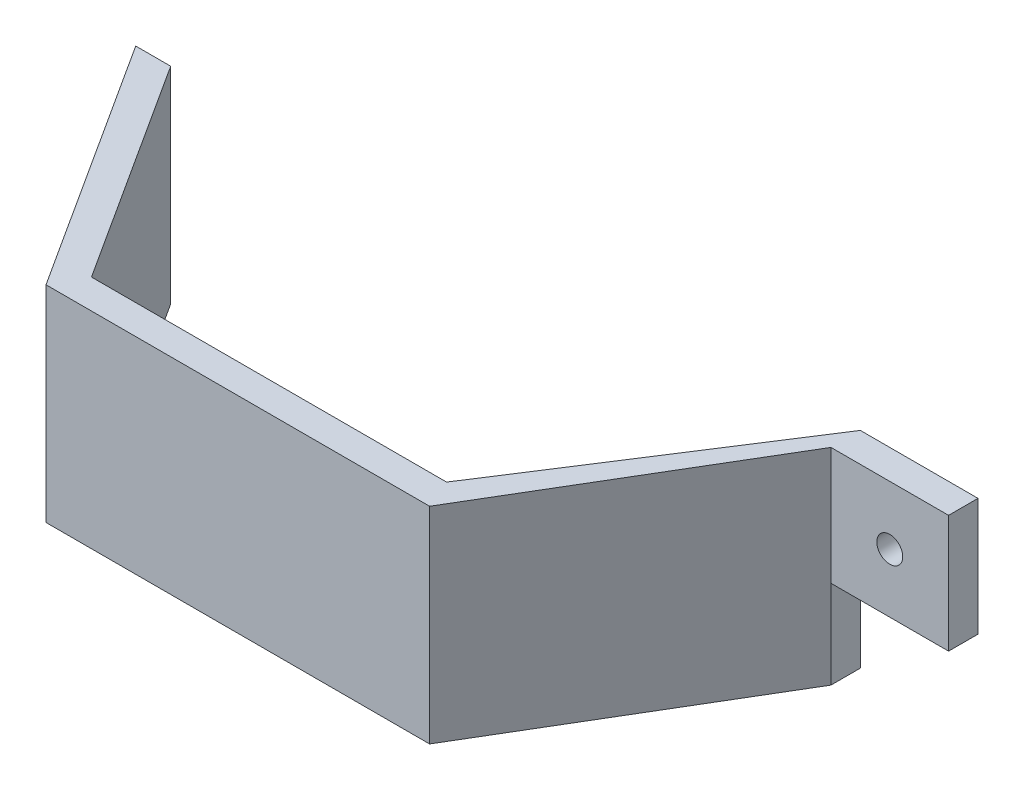
ISO-10303-21;
HEADER;
FILE_DESCRIPTION(('STEP AP214'),'2;1');
FILE_NAME('part.step','',(''),(''),'','','');
FILE_SCHEMA(('AUTOMOTIVE_DESIGN { 1 0 10303 214 1 1 1 1 }'));
ENDSEC;
DATA;
#1=APPLICATION_CONTEXT('core data for automotive mechanical design processes');
#2=APPLICATION_PROTOCOL_DEFINITION('international standard','automotive_design',2000,#1);
#3=PRODUCT_CONTEXT('',#1,'mechanical');
#4=PRODUCT('Part','Part','',(#3));
#5=PRODUCT_RELATED_PRODUCT_CATEGORY('part','',(#4));
#6=PRODUCT_DEFINITION_FORMATION('','',#4);
#7=PRODUCT_DEFINITION_CONTEXT('part definition',#1,'design');
#8=PRODUCT_DEFINITION('design','',#6,#7);
#9=PRODUCT_DEFINITION_SHAPE('','',#8);
#10=(LENGTH_UNIT() NAMED_UNIT(*) SI_UNIT(.MILLI.,.METRE.));
#11=(NAMED_UNIT(*) PLANE_ANGLE_UNIT() SI_UNIT($,.RADIAN.));
#12=(NAMED_UNIT(*) SI_UNIT($,.STERADIAN.) SOLID_ANGLE_UNIT());
#13=UNCERTAINTY_MEASURE_WITH_UNIT(LENGTH_MEASURE(1.E-05),#10,'distance_accuracy_value','');
#14=(GEOMETRIC_REPRESENTATION_CONTEXT(3) GLOBAL_UNCERTAINTY_ASSIGNED_CONTEXT((#13)) GLOBAL_UNIT_ASSIGNED_CONTEXT((#10,
#11,#12)) REPRESENTATION_CONTEXT('',''));
#15=CARTESIAN_POINT('',(0.,0.,0.));
#16=DIRECTION('',(0.,0.,1.));
#17=DIRECTION('',(1.,0.,0.));
#18=AXIS2_PLACEMENT_3D('',#15,#16,#17);
#19=CARTESIAN_POINT('',(-9.9497487437186,-10.3015075376884,5.));
#20=DIRECTION('',(0.,1.,0.));
#21=DIRECTION('',(0.,0.,1.));
#22=AXIS2_PLACEMENT_3D('',#19,#20,#21);
#23=PLANE('',#22);
#24=DIRECTION('',(1.,0.,0.));
#25=VECTOR('',#24,1.);
#26=CARTESIAN_POINT('',(-9.9497487437186,-10.3015075376884,0.));
#27=LINE('',#26,#25);
#28=CARTESIAN_POINT('',(-9.9497487437186,-10.3015075376884,0.));
#29=VERTEX_POINT('',#28);
#30=CARTESIAN_POINT('',(10.0502512562814,-10.3015075376884,0.));
#31=VERTEX_POINT('',#30);
#32=EDGE_CURVE('E62',#29,#31,#27,.T.);
#33=ORIENTED_EDGE('',*,*,#32,.T.);
#34=DIRECTION('',(0.,0.,-1.));
#35=VECTOR('',#34,1.);
#36=CARTESIAN_POINT('',(10.0502512562814,-10.3015075376884,5.));
#37=LINE('',#36,#35);
#38=CARTESIAN_POINT('',(10.0502512562814,-10.3015075376884,5.));
#39=VERTEX_POINT('',#38);
#40=EDGE_CURVE('E41',#39,#31,#37,.T.);
#41=ORIENTED_EDGE('',*,*,#40,.F.);
#42=DIRECTION('',(1.,0.,0.));
#43=VECTOR('',#42,1.);
#44=CARTESIAN_POINT('',(-9.9497487437186,-10.3015075376884,5.));
#45=LINE('',#44,#43);
#46=CARTESIAN_POINT('',(-9.9497487437186,-10.3015075376884,5.));
#47=VERTEX_POINT('',#46);
#48=EDGE_CURVE('E91',#47,#39,#45,.T.);
#49=ORIENTED_EDGE('',*,*,#48,.F.);
#50=DIRECTION('',(0.,0.,-1.));
#51=VECTOR('',#50,1.);
#52=CARTESIAN_POINT('',(-9.9497487437186,-10.3015075376884,5.));
#53=LINE('',#52,#51);
#54=EDGE_CURVE('E11',#47,#29,#53,.T.);
#55=ORIENTED_EDGE('',*,*,#54,.T.);
#56=EDGE_LOOP('',(#33,#41,#49,#55));
#57=FACE_BOUND('',#56,.T.);
#58=ADVANCED_FACE('F33',(#57),#23,.F.);
#59=CARTESIAN_POINT('',(10.0502512562814,9.69849246231156,5.));
#60=DIRECTION('',(-1.,0.,0.));
#61=DIRECTION('',(0.,-1.,0.));
#62=AXIS2_PLACEMENT_3D('',#59,#60,#61);
#63=PLANE('',#62);
#64=DIRECTION('',(0.,1.,0.));
#65=VECTOR('',#64,1.);
#66=CARTESIAN_POINT('',(10.0502512562814,9.69849246231156,0.));
#67=LINE('',#66,#65);
#68=CARTESIAN_POINT('',(10.0502512562814,9.69849246231156,0.));
#69=VERTEX_POINT('',#68);
#70=EDGE_CURVE('E67',#31,#69,#67,.T.);
#71=ORIENTED_EDGE('',*,*,#70,.T.);
#72=DIRECTION('',(0.,0.,-1.));
#73=VECTOR('',#72,1.);
#74=CARTESIAN_POINT('',(10.0502512562814,9.69849246231156,5.));
#75=LINE('',#74,#73);
#76=CARTESIAN_POINT('',(10.0502512562814,9.69849246231156,5.));
#77=VERTEX_POINT('',#76);
#78=EDGE_CURVE('E70',#77,#69,#75,.T.);
#79=ORIENTED_EDGE('',*,*,#78,.F.);
#80=DIRECTION('',(0.,1.,0.));
#81=VECTOR('',#80,1.);
#82=CARTESIAN_POINT('',(10.0502512562814,9.69849246231156,5.));
#83=LINE('',#82,#81);
#84=EDGE_CURVE('E49',#39,#77,#83,.T.);
#85=ORIENTED_EDGE('',*,*,#84,.F.);
#86=ORIENTED_EDGE('',*,*,#40,.T.);
#87=EDGE_LOOP('',(#71,#79,#85,#86));
#88=FACE_BOUND('',#87,.T.);
#89=ADVANCED_FACE('F69',(#88),#63,.F.);
#90=CARTESIAN_POINT('',(-9.9497487437186,9.69849246231156,5.));
#91=DIRECTION('',(0.,-1.,0.));
#92=DIRECTION('',(1.,0.,0.));
#93=AXIS2_PLACEMENT_3D('',#90,#91,#92);
#94=PLANE('',#93);
#95=DIRECTION('',(-1.,0.,0.));
#96=VECTOR('',#95,1.);
#97=CARTESIAN_POINT('',(-9.9497487437186,9.69849246231156,0.));
#98=LINE('',#97,#96);
#99=CARTESIAN_POINT('',(-9.9497487437186,9.69849246231156,0.));
#100=VERTEX_POINT('',#99);
#101=EDGE_CURVE('E74',#69,#100,#98,.T.);
#102=ORIENTED_EDGE('',*,*,#101,.T.);
#103=DIRECTION('',(-0.541636260188725,0.,0.84061296780907));
#104=VECTOR('',#103,1.);
#105=CARTESIAN_POINT('',(-37.5112836926405,9.69849246231156,42.7751710764599));
#106=LINE('',#105,#104);
#107=CARTESIAN_POINT('',(-37.5112836926405,9.69849246231156,42.7751710764599));
#108=VERTEX_POINT('',#107);
#109=EDGE_CURVE('E147',#100,#108,#106,.T.);
#110=ORIENTED_EDGE('',*,*,#109,.T.);
#111=DIRECTION('',(-1.,0.,0.));
#112=VECTOR('',#111,1.);
#113=CARTESIAN_POINT('',(-97.8784909577664,9.69849246231157,42.7751710764599));
#114=LINE('',#113,#112);
#115=CARTESIAN_POINT('',(-97.8784909577664,9.69849246231157,42.7751710764599));
#116=VERTEX_POINT('',#115);
#117=EDGE_CURVE('E144',#108,#116,#114,.T.);
#118=ORIENTED_EDGE('',*,*,#117,.T.);
#119=DIRECTION('',(-0.541084804986544,0.,-0.840968033763872));
#120=VECTOR('',#119,1.);
#121=CARTESIAN_POINT('',(-122.183304285521,9.69849246231157,5.));
#122=LINE('',#121,#120);
#123=CARTESIAN_POINT('',(-122.183304285521,9.69849246231157,5.));
#124=VERTEX_POINT('',#123);
#125=EDGE_CURVE('E141',#116,#124,#122,.T.);
#126=ORIENTED_EDGE('',*,*,#125,.T.);
#127=DIRECTION('',(-1.,0.,0.));
#128=VECTOR('',#127,1.);
#129=CARTESIAN_POINT('',(-128.12883348432,9.69849246231157,5.));
#130=LINE('',#129,#128);
#131=CARTESIAN_POINT('',(-128.12883348432,9.69849246231157,5.));
#132=VERTEX_POINT('',#131);
#133=EDGE_CURVE('E138',#124,#132,#130,.T.);
#134=ORIENTED_EDGE('',*,*,#133,.T.);
#135=DIRECTION('',(0.541084804986544,0.,0.840968033763872));
#136=VECTOR('',#135,1.);
#137=CARTESIAN_POINT('',(-100.606984649492,9.69849246231157,47.7751710764599));
#138=LINE('',#137,#136);
#139=CARTESIAN_POINT('',(-100.606984649492,9.69849246231157,47.7751710764599));
#140=VERTEX_POINT('',#139);
#141=EDGE_CURVE('E135',#132,#140,#138,.T.);
#142=ORIENTED_EDGE('',*,*,#141,.T.);
#143=DIRECTION('',(1.,0.,0.));
#144=VECTOR('',#143,1.);
#145=CARTESIAN_POINT('',(-35.3984769606323,9.69849246231156,47.7751710764599));
#146=LINE('',#145,#144);
#147=CARTESIAN_POINT('',(-35.3984769606323,9.69849246231156,47.7751710764599));
#148=VERTEX_POINT('',#147);
#149=EDGE_CURVE('E132',#140,#148,#146,.T.);
#150=ORIENTED_EDGE('',*,*,#149,.T.);
#151=DIRECTION('',(0.511295692748654,0.,-0.859404860689463));
#152=VECTOR('',#151,1.);
#153=CARTESIAN_POINT('',(-9.9497487437186,9.69849246231156,5.));
#154=LINE('',#153,#152);
#155=CARTESIAN_POINT('',(-9.9497487437186,9.69849246231156,5.));
#156=VERTEX_POINT('',#155);
#157=EDGE_CURVE('E129',#148,#156,#154,.T.);
#158=ORIENTED_EDGE('',*,*,#157,.T.);
#159=DIRECTION('',(-1.,0.,0.));
#160=VECTOR('',#159,1.);
#161=CARTESIAN_POINT('',(-9.9497487437186,9.69849246231156,5.));
#162=LINE('',#161,#160);
#163=EDGE_CURVE('E83',#77,#156,#162,.T.);
#164=ORIENTED_EDGE('',*,*,#163,.F.);
#165=ORIENTED_EDGE('',*,*,#78,.T.);
#166=EDGE_LOOP('',(#102,#110,#118,#126,#134,#142,#150,#158,#164,#165));
#167=FACE_BOUND('',#166,.T.);
#168=ADVANCED_FACE('F78',(#167),#94,.F.);
#169=CARTESIAN_POINT('',(0.,0.,5.));
#170=DIRECTION('',(0.,0.,1.));
#171=DIRECTION('',(1.,0.,0.));
#172=AXIS2_PLACEMENT_3D('',#169,#170,#171);
#173=PLANE('',#172);
#174=CARTESIAN_POINT('',(0.0502512562814052,-0.30150753768844,5.));
#175=DIRECTION('',(0.,0.,1.));
#176=DIRECTION('',(1.,0.,0.));
#177=AXIS2_PLACEMENT_3D('',#174,#175,#176);
#178=CIRCLE('',#177,2.2);
#179=CARTESIAN_POINT('',(2.25025125628141,-0.30150753768844,5.));
#180=VERTEX_POINT('',#179);
#181=EDGE_CURVE('E100',#180,#180,#178,.T.);
#182=ORIENTED_EDGE('',*,*,#181,.F.);
#183=EDGE_LOOP('',(#182));
#184=FACE_BOUND('',#183,.T.);
#185=DIRECTION('',(0.,-1.,0.));
#186=VECTOR('',#185,1.);
#187=CARTESIAN_POINT('',(-9.9497487437186,9.69849246231156,5.));
#188=LINE('',#187,#186);
#189=EDGE_CURVE('E88',#156,#47,#188,.T.);
#190=ORIENTED_EDGE('',*,*,#189,.T.);
#191=ORIENTED_EDGE('',*,*,#48,.T.);
#192=ORIENTED_EDGE('',*,*,#84,.T.);
#193=ORIENTED_EDGE('',*,*,#163,.T.);
#194=EDGE_LOOP('',(#190,#191,#192,#193));
#195=FACE_BOUND('',#194,.T.);
#196=ADVANCED_FACE('F226',(#184,#195),#173,.T.);
#197=CARTESIAN_POINT('',(0.,0.,0.));
#198=DIRECTION('',(0.,0.,1.));
#199=DIRECTION('',(1.,0.,0.));
#200=AXIS2_PLACEMENT_3D('',#197,#198,#199);
#201=PLANE('',#200);
#202=CARTESIAN_POINT('',(0.0502512562814052,-0.30150753768844,0.));
#203=DIRECTION('',(0.,0.,1.));
#204=DIRECTION('',(1.,0.,0.));
#205=AXIS2_PLACEMENT_3D('',#202,#203,#204);
#206=CIRCLE('',#205,2.2);
#207=CARTESIAN_POINT('',(2.25025125628141,-0.30150753768844,0.));
#208=VERTEX_POINT('',#207);
#209=EDGE_CURVE('E96',#208,#208,#206,.T.);
#210=ORIENTED_EDGE('',*,*,#209,.T.);
#211=EDGE_LOOP('',(#210));
#212=FACE_BOUND('',#211,.T.);
#213=DIRECTION('',(0.,-1.,0.));
#214=VECTOR('',#213,1.);
#215=CARTESIAN_POINT('',(-9.9497487437186,9.69849246231156,0.));
#216=LINE('',#215,#214);
#217=EDGE_CURVE('E87',#100,#29,#216,.T.);
#218=ORIENTED_EDGE('',*,*,#217,.F.);
#219=ORIENTED_EDGE('',*,*,#101,.F.);
#220=ORIENTED_EDGE('',*,*,#70,.F.);
#221=ORIENTED_EDGE('',*,*,#32,.F.);
#222=EDGE_LOOP('',(#218,#219,#220,#221));
#223=FACE_BOUND('',#222,.T.);
#224=ADVANCED_FACE('F85',(#212,#223),#201,.F.);
#225=CARTESIAN_POINT('',(0.0502512562814052,-0.30150753768844,0.));
#226=DIRECTION('',(0.,0.,1.));
#227=DIRECTION('',(1.,0.,0.));
#228=AXIS2_PLACEMENT_3D('',#225,#226,#227);
#229=CYLINDRICAL_SURFACE('',#228,2.2);
#230=ORIENTED_EDGE('',*,*,#209,.F.);
#231=EDGE_LOOP('',(#230));
#232=FACE_BOUND('',#231,.T.);
#233=ORIENTED_EDGE('',*,*,#181,.T.);
#234=EDGE_LOOP('',(#233));
#235=FACE_BOUND('',#234,.T.);
#236=ADVANCED_FACE('F266',(#232,#235),#229,.F.);
#237=CARTESIAN_POINT('',(-9.9497487437186,-25.3015075376885,0.));
#238=DIRECTION('',(1.,0.,0.));
#239=DIRECTION('',(0.,1.,0.));
#240=AXIS2_PLACEMENT_3D('',#237,#238,#239);
#241=PLANE('',#240);
#242=ORIENTED_EDGE('',*,*,#54,.F.);
#243=DIRECTION('',(0.,1.,0.));
#244=VECTOR('',#243,1.);
#245=CARTESIAN_POINT('',(-9.9497487437186,-25.3015075376885,5.));
#246=LINE('',#245,#244);
#247=CARTESIAN_POINT('',(-9.9497487437186,-25.3015075376885,5.));
#248=VERTEX_POINT('',#247);
#249=EDGE_CURVE('E103',#248,#47,#246,.T.);
#250=ORIENTED_EDGE('',*,*,#249,.F.);
#251=DIRECTION('',(0.,0.,-1.));
#252=VECTOR('',#251,1.);
#253=CARTESIAN_POINT('',(-9.9497487437186,-25.3015075376885,0.));
#254=LINE('',#253,#252);
#255=CARTESIAN_POINT('',(-9.9497487437186,-25.3015075376885,0.));
#256=VERTEX_POINT('',#255);
#257=EDGE_CURVE('E131',#248,#256,#254,.T.);
#258=ORIENTED_EDGE('',*,*,#257,.T.);
#259=DIRECTION('',(0.,1.,0.));
#260=VECTOR('',#259,1.);
#261=CARTESIAN_POINT('',(-9.9497487437186,-25.3015075376885,0.));
#262=LINE('',#261,#260);
#263=EDGE_CURVE('E106',#256,#29,#262,.T.);
#264=ORIENTED_EDGE('',*,*,#263,.T.);
#265=EDGE_LOOP('',(#242,#250,#258,#264));
#266=FACE_BOUND('',#265,.T.);
#267=ADVANCED_FACE('F175',(#266),#241,.T.);
#268=CARTESIAN_POINT('',(-9.9497487437186,-25.3015075376885,5.));
#269=DIRECTION('',(0.859404860689462,0.,0.511295692748653));
#270=DIRECTION('',(0.511295692748654,0.,-0.859404860689463));
#271=AXIS2_PLACEMENT_3D('',#268,#269,#270);
#272=PLANE('',#271);
#273=ORIENTED_EDGE('',*,*,#157,.F.);
#274=DIRECTION('',(0.,1.,0.));
#275=VECTOR('',#274,1.);
#276=CARTESIAN_POINT('',(-35.3984769606323,-25.3015075376885,47.7751710764599));
#277=LINE('',#276,#275);
#278=CARTESIAN_POINT('',(-35.3984769606323,-25.3015075376885,47.7751710764599));
#279=VERTEX_POINT('',#278);
#280=EDGE_CURVE('E124',#279,#148,#277,.T.);
#281=ORIENTED_EDGE('',*,*,#280,.F.);
#282=DIRECTION('',(0.511295692748654,0.,-0.859404860689463));
#283=VECTOR('',#282,1.);
#284=CARTESIAN_POINT('',(-9.9497487437186,-25.3015075376885,5.));
#285=LINE('',#284,#283);
#286=EDGE_CURVE('E109',#279,#248,#285,.T.);
#287=ORIENTED_EDGE('',*,*,#286,.T.);
#288=ORIENTED_EDGE('',*,*,#249,.T.);
#289=ORIENTED_EDGE('',*,*,#189,.F.);
#290=EDGE_LOOP('',(#273,#281,#287,#288,#289));
#291=FACE_BOUND('',#290,.T.);
#292=ADVANCED_FACE('F192',(#291),#272,.T.);
#293=CARTESIAN_POINT('',(-35.3984769606323,-25.3015075376885,47.7751710764599));
#294=DIRECTION('',(0.,0.,1.));
#295=DIRECTION('',(1.,0.,0.));
#296=AXIS2_PLACEMENT_3D('',#293,#294,#295);
#297=PLANE('',#296);
#298=ORIENTED_EDGE('',*,*,#149,.F.);
#299=DIRECTION('',(0.,1.,0.));
#300=VECTOR('',#299,1.);
#301=CARTESIAN_POINT('',(-100.606984649492,-25.3015075376884,47.7751710764599));
#302=LINE('',#301,#300);
#303=CARTESIAN_POINT('',(-100.606984649492,-25.3015075376884,47.7751710764599));
#304=VERTEX_POINT('',#303);
#305=EDGE_CURVE('E121',#304,#140,#302,.T.);
#306=ORIENTED_EDGE('',*,*,#305,.F.);
#307=DIRECTION('',(1.,0.,0.));
#308=VECTOR('',#307,1.);
#309=CARTESIAN_POINT('',(-35.3984769606323,-25.3015075376885,47.7751710764599));
#310=LINE('',#309,#308);
#311=EDGE_CURVE('E151',#304,#279,#310,.T.);
#312=ORIENTED_EDGE('',*,*,#311,.T.);
#313=ORIENTED_EDGE('',*,*,#280,.T.);
#314=EDGE_LOOP('',(#298,#306,#312,#313));
#315=FACE_BOUND('',#314,.T.);
#316=ADVANCED_FACE('F201',(#315),#297,.T.);
#317=CARTESIAN_POINT('',(-100.606984649492,-25.3015075376884,47.7751710764599));
#318=DIRECTION('',(-0.840968033763872,0.,0.541084804986544));
#319=DIRECTION('',(0.541084804986544,0.,0.840968033763872));
#320=AXIS2_PLACEMENT_3D('',#317,#318,#319);
#321=PLANE('',#320);
#322=ORIENTED_EDGE('',*,*,#141,.F.);
#323=DIRECTION('',(0.,1.,0.));
#324=VECTOR('',#323,1.);
#325=CARTESIAN_POINT('',(-128.12883348432,-25.3015075376884,5.));
#326=LINE('',#325,#324);
#327=CARTESIAN_POINT('',(-128.12883348432,-25.3015075376884,5.));
#328=VERTEX_POINT('',#327);
#329=EDGE_CURVE('E118',#328,#132,#326,.T.);
#330=ORIENTED_EDGE('',*,*,#329,.F.);
#331=DIRECTION('',(0.541084804986544,0.,0.840968033763872));
#332=VECTOR('',#331,1.);
#333=CARTESIAN_POINT('',(-100.606984649492,-25.3015075376884,47.7751710764599));
#334=LINE('',#333,#332);
#335=EDGE_CURVE('E154',#328,#304,#334,.T.);
#336=ORIENTED_EDGE('',*,*,#335,.T.);
#337=ORIENTED_EDGE('',*,*,#305,.T.);
#338=EDGE_LOOP('',(#322,#330,#336,#337));
#339=FACE_BOUND('',#338,.T.);
#340=ADVANCED_FACE('F209',(#339),#321,.T.);
#341=CARTESIAN_POINT('',(-128.12883348432,-25.3015075376884,5.));
#342=DIRECTION('',(0.,0.,-1.));
#343=DIRECTION('',(-1.,0.,0.));
#344=AXIS2_PLACEMENT_3D('',#341,#342,#343);
#345=PLANE('',#344);
#346=ORIENTED_EDGE('',*,*,#133,.F.);
#347=DIRECTION('',(0.,1.,0.));
#348=VECTOR('',#347,1.);
#349=CARTESIAN_POINT('',(-122.183304285521,-25.3015075376884,5.));
#350=LINE('',#349,#348);
#351=CARTESIAN_POINT('',(-122.183304285521,-25.3015075376884,5.));
#352=VERTEX_POINT('',#351);
#353=EDGE_CURVE('E115',#352,#124,#350,.T.);
#354=ORIENTED_EDGE('',*,*,#353,.F.);
#355=DIRECTION('',(-1.,0.,0.));
#356=VECTOR('',#355,1.);
#357=CARTESIAN_POINT('',(-128.12883348432,-25.3015075376884,5.));
#358=LINE('',#357,#356);
#359=EDGE_CURVE('E157',#352,#328,#358,.T.);
#360=ORIENTED_EDGE('',*,*,#359,.T.);
#361=ORIENTED_EDGE('',*,*,#329,.T.);
#362=EDGE_LOOP('',(#346,#354,#360,#361));
#363=FACE_BOUND('',#362,.T.);
#364=ADVANCED_FACE('F216',(#363),#345,.T.);
#365=CARTESIAN_POINT('',(-122.183304285521,-25.3015075376884,5.));
#366=DIRECTION('',(0.840968033763872,0.,-0.541084804986544));
#367=DIRECTION('',(-0.541084804986544,0.,-0.840968033763872));
#368=AXIS2_PLACEMENT_3D('',#365,#366,#367);
#369=PLANE('',#368);
#370=ORIENTED_EDGE('',*,*,#125,.F.);
#371=DIRECTION('',(0.,1.,0.));
#372=VECTOR('',#371,1.);
#373=CARTESIAN_POINT('',(-97.8784909577664,-25.3015075376884,42.7751710764599));
#374=LINE('',#373,#372);
#375=CARTESIAN_POINT('',(-97.8784909577664,-25.3015075376884,42.7751710764599));
#376=VERTEX_POINT('',#375);
#377=EDGE_CURVE('E112',#376,#116,#374,.T.);
#378=ORIENTED_EDGE('',*,*,#377,.F.);
#379=DIRECTION('',(-0.541084804986544,0.,-0.840968033763872));
#380=VECTOR('',#379,1.);
#381=CARTESIAN_POINT('',(-122.183304285521,-25.3015075376884,5.));
#382=LINE('',#381,#380);
#383=EDGE_CURVE('E160',#376,#352,#382,.T.);
#384=ORIENTED_EDGE('',*,*,#383,.T.);
#385=ORIENTED_EDGE('',*,*,#353,.T.);
#386=EDGE_LOOP('',(#370,#378,#384,#385));
#387=FACE_BOUND('',#386,.T.);
#388=ADVANCED_FACE('F231',(#387),#369,.T.);
#389=CARTESIAN_POINT('',(-97.8784909577664,-25.3015075376884,42.7751710764599));
#390=DIRECTION('',(0.,0.,-1.));
#391=DIRECTION('',(-1.,0.,0.));
#392=AXIS2_PLACEMENT_3D('',#389,#390,#391);
#393=PLANE('',#392);
#394=ORIENTED_EDGE('',*,*,#117,.F.);
#395=DIRECTION('',(0.,1.,0.));
#396=VECTOR('',#395,1.);
#397=CARTESIAN_POINT('',(-37.5112836926405,-25.3015075376885,42.7751710764599));
#398=LINE('',#397,#396);
#399=CARTESIAN_POINT('',(-37.5112836926405,-25.3015075376885,42.7751710764599));
#400=VERTEX_POINT('',#399);
#401=EDGE_CURVE('E108',#400,#108,#398,.T.);
#402=ORIENTED_EDGE('',*,*,#401,.F.);
#403=DIRECTION('',(-1.,0.,0.));
#404=VECTOR('',#403,1.);
#405=CARTESIAN_POINT('',(-97.8784909577664,-25.3015075376884,42.7751710764599));
#406=LINE('',#405,#404);
#407=EDGE_CURVE('E163',#400,#376,#406,.T.);
#408=ORIENTED_EDGE('',*,*,#407,.T.);
#409=ORIENTED_EDGE('',*,*,#377,.T.);
#410=EDGE_LOOP('',(#394,#402,#408,#409));
#411=FACE_BOUND('',#410,.T.);
#412=ADVANCED_FACE('F243',(#411),#393,.T.);
#413=CARTESIAN_POINT('',(-37.5112836926405,-25.3015075376885,42.7751710764599));
#414=DIRECTION('',(-0.84061296780907,0.,-0.541636260188725));
#415=DIRECTION('',(-0.541636260188725,0.,0.84061296780907));
#416=AXIS2_PLACEMENT_3D('',#413,#414,#415);
#417=PLANE('',#416);
#418=ORIENTED_EDGE('',*,*,#109,.F.);
#419=ORIENTED_EDGE('',*,*,#217,.T.);
#420=ORIENTED_EDGE('',*,*,#263,.F.);
#421=DIRECTION('',(-0.541636260188725,0.,0.84061296780907));
#422=VECTOR('',#421,1.);
#423=CARTESIAN_POINT('',(-37.5112836926405,-25.3015075376885,42.7751710764599));
#424=LINE('',#423,#422);
#425=EDGE_CURVE('E166',#256,#400,#424,.T.);
#426=ORIENTED_EDGE('',*,*,#425,.T.);
#427=ORIENTED_EDGE('',*,*,#401,.T.);
#428=EDGE_LOOP('',(#418,#419,#420,#426,#427));
#429=FACE_BOUND('',#428,.T.);
#430=ADVANCED_FACE('F245',(#429),#417,.T.);
#431=CARTESIAN_POINT('',(0.,-25.3015075376885,0.));
#432=DIRECTION('',(0.,-1.,0.));
#433=DIRECTION('',(1.,0.,0.));
#434=AXIS2_PLACEMENT_3D('',#431,#432,#433);
#435=PLANE('',#434);
#436=ORIENTED_EDGE('',*,*,#257,.F.);
#437=ORIENTED_EDGE('',*,*,#286,.F.);
#438=ORIENTED_EDGE('',*,*,#311,.F.);
#439=ORIENTED_EDGE('',*,*,#335,.F.);
#440=ORIENTED_EDGE('',*,*,#359,.F.);
#441=ORIENTED_EDGE('',*,*,#383,.F.);
#442=ORIENTED_EDGE('',*,*,#407,.F.);
#443=ORIENTED_EDGE('',*,*,#425,.F.);
#444=EDGE_LOOP('',(#436,#437,#438,#439,#440,#441,#442,#443));
#445=FACE_BOUND('',#444,.T.);
#446=ADVANCED_FACE('F184',(#445),#435,.T.);
#447=CLOSED_SHELL('',(#58,#89,#168,#196,#224,#236,#267,#292,#316,#340,#364,#388,#412,#430,#446));
#448=MANIFOLD_SOLID_BREP('B2',#447);
#449=ADVANCED_BREP_SHAPE_REPRESENTATION('',(#18,#448),#14);
#450=SHAPE_DEFINITION_REPRESENTATION(#9,#449);
ENDSEC;
END-ISO-10303-21;
